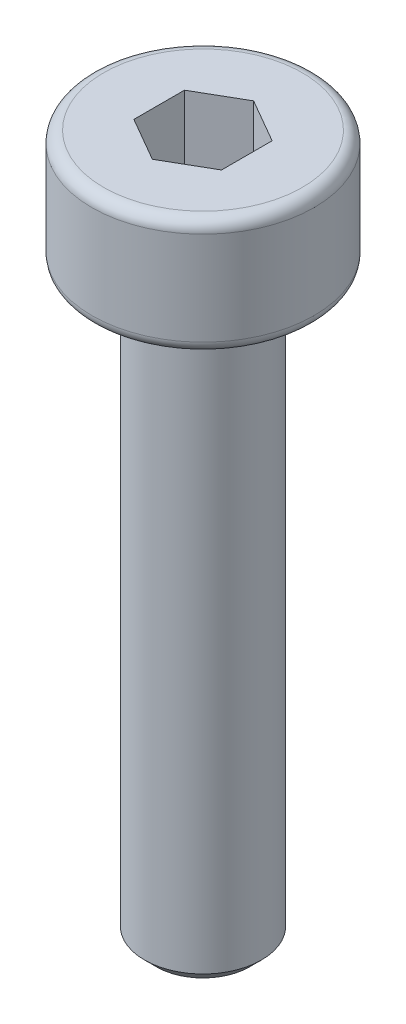
ISO-10303-21;
HEADER;
FILE_DESCRIPTION(('STEP AP214'),'2;1');
FILE_NAME('part.step','',(''),(''),'','','');
FILE_SCHEMA(('AUTOMOTIVE_DESIGN { 1 0 10303 214 1 1 1 1 }'));
ENDSEC;
DATA;
#1=APPLICATION_CONTEXT('core data for automotive mechanical design processes');
#2=APPLICATION_PROTOCOL_DEFINITION('international standard','automotive_design',2000,#1);
#3=PRODUCT_CONTEXT('',#1,'mechanical');
#4=PRODUCT('Part','Part','',(#3));
#5=PRODUCT_RELATED_PRODUCT_CATEGORY('part','',(#4));
#6=PRODUCT_DEFINITION_FORMATION('','',#4);
#7=PRODUCT_DEFINITION_CONTEXT('part definition',#1,'design');
#8=PRODUCT_DEFINITION('design','',#6,#7);
#9=PRODUCT_DEFINITION_SHAPE('','',#8);
#10=(LENGTH_UNIT() NAMED_UNIT(*) SI_UNIT(.MILLI.,.METRE.));
#11=(NAMED_UNIT(*) PLANE_ANGLE_UNIT() SI_UNIT($,.RADIAN.));
#12=(NAMED_UNIT(*) SI_UNIT($,.STERADIAN.) SOLID_ANGLE_UNIT());
#13=UNCERTAINTY_MEASURE_WITH_UNIT(LENGTH_MEASURE(1.E-05),#10,'distance_accuracy_value','');
#14=(GEOMETRIC_REPRESENTATION_CONTEXT(3) GLOBAL_UNCERTAINTY_ASSIGNED_CONTEXT((#13)) GLOBAL_UNIT_ASSIGNED_CONTEXT((#10,
#11,#12)) REPRESENTATION_CONTEXT('',''));
#15=CARTESIAN_POINT('',(0.,0.,0.));
#16=DIRECTION('',(0.,0.,1.));
#17=DIRECTION('',(1.,0.,0.));
#18=AXIS2_PLACEMENT_3D('',#15,#16,#17);
#19=CARTESIAN_POINT('',(0.,2.,0.));
#20=DIRECTION('',(0.,1.,0.));
#21=DIRECTION('',(0.,0.,1.));
#22=AXIS2_PLACEMENT_3D('',#19,#20,#21);
#23=PLANE('',#22);
#24=CARTESIAN_POINT('',(0.,2.,0.));
#25=DIRECTION('',(0.,1.,0.));
#26=DIRECTION('',(0.,0.,1.));
#27=AXIS2_PLACEMENT_3D('',#24,#25,#26);
#28=CIRCLE('',#27,1.7);
#29=CARTESIAN_POINT('',(0.,2.,1.7));
#30=VERTEX_POINT('',#29);
#31=EDGE_CURVE('E127',#30,#30,#28,.T.);
#32=ORIENTED_EDGE('',*,*,#31,.T.);
#33=EDGE_LOOP('',(#32));
#34=FACE_BOUND('',#33,.T.);
#35=DIRECTION('',(-0.866025403784439,0.,0.5));
#36=VECTOR('',#35,1.);
#37=CARTESIAN_POINT('',(0.,2.,-0.866025403784439));
#38=LINE('',#37,#36);
#39=CARTESIAN_POINT('',(0.,2.,-0.866025403784439));
#40=VERTEX_POINT('',#39);
#41=CARTESIAN_POINT('',(-0.75,2.,-0.43301270189222));
#42=VERTEX_POINT('',#41);
#43=EDGE_CURVE('E32',#40,#42,#38,.T.);
#44=ORIENTED_EDGE('',*,*,#43,.F.);
#45=DIRECTION('',(-0.866025403784439,0.,-0.5));
#46=VECTOR('',#45,1.);
#47=CARTESIAN_POINT('',(0.75,2.,-0.43301270189222));
#48=LINE('',#47,#46);
#49=CARTESIAN_POINT('',(0.75,2.,-0.43301270189222));
#50=VERTEX_POINT('',#49);
#51=EDGE_CURVE('E115',#50,#40,#48,.T.);
#52=ORIENTED_EDGE('',*,*,#51,.F.);
#53=DIRECTION('',(0.,0.,-1.));
#54=VECTOR('',#53,1.);
#55=CARTESIAN_POINT('',(0.75,2.,0.433012701892219));
#56=LINE('',#55,#54);
#57=CARTESIAN_POINT('',(0.75,2.,0.433012701892219));
#58=VERTEX_POINT('',#57);
#59=EDGE_CURVE('E113',#58,#50,#56,.T.);
#60=ORIENTED_EDGE('',*,*,#59,.F.);
#61=DIRECTION('',(0.866025403784439,0.,-0.5));
#62=VECTOR('',#61,1.);
#63=CARTESIAN_POINT('',(0.,2.,0.866025403784439));
#64=LINE('',#63,#62);
#65=CARTESIAN_POINT('',(0.,2.,0.866025403784439));
#66=VERTEX_POINT('',#65);
#67=EDGE_CURVE('E80',#66,#58,#64,.T.);
#68=ORIENTED_EDGE('',*,*,#67,.F.);
#69=DIRECTION('',(0.866025403784439,0.,0.5));
#70=VECTOR('',#69,1.);
#71=CARTESIAN_POINT('',(-0.75,2.,0.43301270189222));
#72=LINE('',#71,#70);
#73=CARTESIAN_POINT('',(-0.75,2.,0.43301270189222));
#74=VERTEX_POINT('',#73);
#75=EDGE_CURVE('E109',#74,#66,#72,.T.);
#76=ORIENTED_EDGE('',*,*,#75,.F.);
#77=DIRECTION('',(0.,0.,1.));
#78=VECTOR('',#77,1.);
#79=CARTESIAN_POINT('',(-0.75,2.,-0.43301270189222));
#80=LINE('',#79,#78);
#81=EDGE_CURVE('E106',#42,#74,#80,.T.);
#82=ORIENTED_EDGE('',*,*,#81,.F.);
#83=EDGE_LOOP('',(#44,#52,#60,#68,#76,#82));
#84=FACE_BOUND('',#83,.T.);
#85=ADVANCED_FACE('F17',(#34,#84),#23,.T.);
#86=CARTESIAN_POINT('',(0.,60.1595545799248,0.));
#87=DIRECTION('',(0.,1.,0.));
#88=DIRECTION('',(0.,0.,1.));
#89=AXIS2_PLACEMENT_3D('',#86,#87,#88);
#90=CYLINDRICAL_SURFACE('',#89,1.9);
#91=CARTESIAN_POINT('',(0.,1.8,0.));
#92=DIRECTION('',(0.,1.,0.));
#93=DIRECTION('',(0.,0.,1.));
#94=AXIS2_PLACEMENT_3D('',#91,#92,#93);
#95=CIRCLE('',#94,1.9);
#96=CARTESIAN_POINT('',(0.,1.8,1.9));
#97=VERTEX_POINT('',#96);
#98=EDGE_CURVE('E133',#97,#97,#95,.F.);
#99=ORIENTED_EDGE('',*,*,#98,.T.);
#100=EDGE_LOOP('',(#99));
#101=FACE_BOUND('',#100,.T.);
#102=CARTESIAN_POINT('',(0.,0.2,0.));
#103=DIRECTION('',(0.,-1.,0.));
#104=DIRECTION('',(0.,0.,-1.));
#105=AXIS2_PLACEMENT_3D('',#102,#103,#104);
#106=CIRCLE('',#105,1.9);
#107=CARTESIAN_POINT('',(0.,0.2,-1.9));
#108=VERTEX_POINT('',#107);
#109=EDGE_CURVE('E130',#108,#108,#106,.F.);
#110=ORIENTED_EDGE('',*,*,#109,.T.);
#111=EDGE_LOOP('',(#110));
#112=FACE_BOUND('',#111,.T.);
#113=ADVANCED_FACE('F156',(#101,#112),#90,.T.);
#114=CARTESIAN_POINT('',(-1.,0.,0.));
#115=DIRECTION('',(0.,-1.,0.));
#116=DIRECTION('',(0.,0.,-1.));
#117=AXIS2_PLACEMENT_3D('',#114,#115,#116);
#118=PLANE('',#117);
#119=CARTESIAN_POINT('',(0.,0.,0.));
#120=DIRECTION('',(0.,-1.,0.));
#121=DIRECTION('',(0.,0.,-1.));
#122=AXIS2_PLACEMENT_3D('',#119,#120,#121);
#123=CIRCLE('',#122,1.7);
#124=CARTESIAN_POINT('',(0.,0.,-1.7));
#125=VERTEX_POINT('',#124);
#126=EDGE_CURVE('E136',#125,#125,#123,.T.);
#127=ORIENTED_EDGE('',*,*,#126,.T.);
#128=EDGE_LOOP('',(#127));
#129=FACE_BOUND('',#128,.T.);
#130=CARTESIAN_POINT('',(0.,0.,0.));
#131=DIRECTION('',(0.,1.,0.));
#132=DIRECTION('',(0.,0.,1.));
#133=AXIS2_PLACEMENT_3D('',#130,#131,#132);
#134=CIRCLE('',#133,1.);
#135=CARTESIAN_POINT('',(0.,0.,1.));
#136=VERTEX_POINT('',#135);
#137=EDGE_CURVE('E119',#136,#136,#134,.T.);
#138=ORIENTED_EDGE('',*,*,#137,.T.);
#139=EDGE_LOOP('',(#138));
#140=FACE_BOUND('',#139,.T.);
#141=ADVANCED_FACE('F163',(#129,#140),#118,.T.);
#142=CARTESIAN_POINT('',(0.,60.1595545799248,0.));
#143=DIRECTION('',(0.,1.,0.));
#144=DIRECTION('',(0.,0.,1.));
#145=AXIS2_PLACEMENT_3D('',#142,#143,#144);
#146=CYLINDRICAL_SURFACE('',#145,1.);
#147=CARTESIAN_POINT('',(0.,-9.8,0.));
#148=DIRECTION('',(0.,-1.,0.));
#149=DIRECTION('',(0.,0.,-1.));
#150=AXIS2_PLACEMENT_3D('',#147,#148,#149);
#151=CIRCLE('',#150,1.);
#152=CARTESIAN_POINT('',(0.,-9.8,-1.));
#153=VERTEX_POINT('',#152);
#154=EDGE_CURVE('E25',#153,#153,#151,.F.);
#155=ORIENTED_EDGE('',*,*,#154,.T.);
#156=EDGE_LOOP('',(#155));
#157=FACE_BOUND('',#156,.T.);
#158=ORIENTED_EDGE('',*,*,#137,.F.);
#159=EDGE_LOOP('',(#158));
#160=FACE_BOUND('',#159,.T.);
#161=ADVANCED_FACE('F141',(#157,#160),#146,.T.);
#162=CARTESIAN_POINT('',(0.,-10.,0.));
#163=DIRECTION('',(0.,-1.,0.));
#164=DIRECTION('',(0.,0.,-1.));
#165=AXIS2_PLACEMENT_3D('',#162,#163,#164);
#166=PLANE('',#165);
#167=CARTESIAN_POINT('',(0.,-10.,0.));
#168=DIRECTION('',(0.,-1.,0.));
#169=DIRECTION('',(0.,0.,-1.));
#170=AXIS2_PLACEMENT_3D('',#167,#168,#169);
#171=CIRCLE('',#170,0.799999999999985);
#172=CARTESIAN_POINT('',(0.,-10.,-0.799999999999985));
#173=VERTEX_POINT('',#172);
#174=EDGE_CURVE('E11',#173,#173,#171,.T.);
#175=ORIENTED_EDGE('',*,*,#174,.T.);
#176=EDGE_LOOP('',(#175));
#177=FACE_BOUND('',#176,.T.);
#178=ADVANCED_FACE('F204',(#177),#166,.T.);
#179=CARTESIAN_POINT('',(0.,0.7,-0.866025403784439));
#180=DIRECTION('',(-0.5,0.,-0.866025403784439));
#181=DIRECTION('',(-0.866025403784439,0.,0.5));
#182=AXIS2_PLACEMENT_3D('',#179,#180,#181);
#183=PLANE('',#182);
#184=ORIENTED_EDGE('',*,*,#43,.T.);
#185=DIRECTION('',(0.,1.,0.));
#186=VECTOR('',#185,1.);
#187=CARTESIAN_POINT('',(-0.75,0.7,-0.43301270189222));
#188=LINE('',#187,#186);
#189=CARTESIAN_POINT('',(-0.75,0.7,-0.43301270189222));
#190=VERTEX_POINT('',#189);
#191=EDGE_CURVE('E62',#190,#42,#188,.T.);
#192=ORIENTED_EDGE('',*,*,#191,.F.);
#193=DIRECTION('',(-0.866025403784439,0.,0.5));
#194=VECTOR('',#193,1.);
#195=CARTESIAN_POINT('',(0.,0.7,-0.866025403784439));
#196=LINE('',#195,#194);
#197=CARTESIAN_POINT('',(0.,0.7,-0.866025403784439));
#198=VERTEX_POINT('',#197);
#199=EDGE_CURVE('E117',#198,#190,#196,.T.);
#200=ORIENTED_EDGE('',*,*,#199,.F.);
#201=DIRECTION('',(0.,1.,0.));
#202=VECTOR('',#201,1.);
#203=CARTESIAN_POINT('',(0.,0.7,-0.866025403784439));
#204=LINE('',#203,#202);
#205=EDGE_CURVE('E40',#198,#40,#204,.T.);
#206=ORIENTED_EDGE('',*,*,#205,.T.);
#207=EDGE_LOOP('',(#184,#192,#200,#206));
#208=FACE_BOUND('',#207,.T.);
#209=ADVANCED_FACE('F194',(#208),#183,.F.);
#210=CARTESIAN_POINT('',(0.75,0.7,-0.43301270189222));
#211=DIRECTION('',(0.5,0.,-0.866025403784439));
#212=DIRECTION('',(-0.866025403784439,0.,-0.5));
#213=AXIS2_PLACEMENT_3D('',#210,#211,#212);
#214=PLANE('',#213);
#215=ORIENTED_EDGE('',*,*,#51,.T.);
#216=ORIENTED_EDGE('',*,*,#205,.F.);
#217=DIRECTION('',(-0.866025403784439,0.,-0.5));
#218=VECTOR('',#217,1.);
#219=CARTESIAN_POINT('',(0.75,0.7,-0.43301270189222));
#220=LINE('',#219,#218);
#221=CARTESIAN_POINT('',(0.75,0.7,-0.43301270189222));
#222=VERTEX_POINT('',#221);
#223=EDGE_CURVE('E92',#222,#198,#220,.T.);
#224=ORIENTED_EDGE('',*,*,#223,.F.);
#225=DIRECTION('',(0.,1.,0.));
#226=VECTOR('',#225,1.);
#227=CARTESIAN_POINT('',(0.75,0.7,-0.43301270189222));
#228=LINE('',#227,#226);
#229=EDGE_CURVE('E84',#222,#50,#228,.T.);
#230=ORIENTED_EDGE('',*,*,#229,.T.);
#231=EDGE_LOOP('',(#215,#216,#224,#230));
#232=FACE_BOUND('',#231,.T.);
#233=ADVANCED_FACE('F191',(#232),#214,.F.);
#234=CARTESIAN_POINT('',(0.75,0.7,0.433012701892219));
#235=DIRECTION('',(1.,0.,0.));
#236=DIRECTION('',(0.,0.,-1.));
#237=AXIS2_PLACEMENT_3D('',#234,#235,#236);
#238=PLANE('',#237);
#239=ORIENTED_EDGE('',*,*,#59,.T.);
#240=ORIENTED_EDGE('',*,*,#229,.F.);
#241=DIRECTION('',(0.,0.,-1.));
#242=VECTOR('',#241,1.);
#243=CARTESIAN_POINT('',(0.75,0.7,0.433012701892219));
#244=LINE('',#243,#242);
#245=CARTESIAN_POINT('',(0.75,0.7,0.433012701892219));
#246=VERTEX_POINT('',#245);
#247=EDGE_CURVE('E88',#246,#222,#244,.T.);
#248=ORIENTED_EDGE('',*,*,#247,.F.);
#249=DIRECTION('',(0.,1.,0.));
#250=VECTOR('',#249,1.);
#251=CARTESIAN_POINT('',(0.75,0.7,0.433012701892219));
#252=LINE('',#251,#250);
#253=EDGE_CURVE('E73',#246,#58,#252,.T.);
#254=ORIENTED_EDGE('',*,*,#253,.T.);
#255=EDGE_LOOP('',(#239,#240,#248,#254));
#256=FACE_BOUND('',#255,.T.);
#257=ADVANCED_FACE('F89',(#256),#238,.F.);
#258=CARTESIAN_POINT('',(0.,0.7,0.866025403784439));
#259=DIRECTION('',(0.5,0.,0.866025403784439));
#260=DIRECTION('',(0.866025403784439,0.,-0.5));
#261=AXIS2_PLACEMENT_3D('',#258,#259,#260);
#262=PLANE('',#261);
#263=ORIENTED_EDGE('',*,*,#67,.T.);
#264=ORIENTED_EDGE('',*,*,#253,.F.);
#265=DIRECTION('',(0.866025403784439,0.,-0.5));
#266=VECTOR('',#265,1.);
#267=CARTESIAN_POINT('',(0.,0.7,0.866025403784439));
#268=LINE('',#267,#266);
#269=CARTESIAN_POINT('',(0.,0.7,0.866025403784439));
#270=VERTEX_POINT('',#269);
#271=EDGE_CURVE('E77',#270,#246,#268,.T.);
#272=ORIENTED_EDGE('',*,*,#271,.F.);
#273=DIRECTION('',(0.,1.,0.));
#274=VECTOR('',#273,1.);
#275=CARTESIAN_POINT('',(0.,0.7,0.866025403784439));
#276=LINE('',#275,#274);
#277=EDGE_CURVE('E85',#270,#66,#276,.T.);
#278=ORIENTED_EDGE('',*,*,#277,.T.);
#279=EDGE_LOOP('',(#263,#264,#272,#278));
#280=FACE_BOUND('',#279,.T.);
#281=ADVANCED_FACE('F75',(#280),#262,.F.);
#282=CARTESIAN_POINT('',(-0.75,0.7,0.43301270189222));
#283=DIRECTION('',(-0.5,0.,0.866025403784439));
#284=DIRECTION('',(0.866025403784439,0.,0.5));
#285=AXIS2_PLACEMENT_3D('',#282,#283,#284);
#286=PLANE('',#285);
#287=ORIENTED_EDGE('',*,*,#75,.T.);
#288=ORIENTED_EDGE('',*,*,#277,.F.);
#289=DIRECTION('',(0.866025403784439,0.,0.5));
#290=VECTOR('',#289,1.);
#291=CARTESIAN_POINT('',(-0.75,0.7,0.43301270189222));
#292=LINE('',#291,#290);
#293=CARTESIAN_POINT('',(-0.75,0.7,0.43301270189222));
#294=VERTEX_POINT('',#293);
#295=EDGE_CURVE('E98',#294,#270,#292,.T.);
#296=ORIENTED_EDGE('',*,*,#295,.F.);
#297=DIRECTION('',(0.,1.,0.));
#298=VECTOR('',#297,1.);
#299=CARTESIAN_POINT('',(-0.75,0.7,0.43301270189222));
#300=LINE('',#299,#298);
#301=EDGE_CURVE('E122',#294,#74,#300,.T.);
#302=ORIENTED_EDGE('',*,*,#301,.T.);
#303=EDGE_LOOP('',(#287,#288,#296,#302));
#304=FACE_BOUND('',#303,.T.);
#305=ADVANCED_FACE('F187',(#304),#286,.F.);
#306=CARTESIAN_POINT('',(-0.75,0.7,-0.43301270189222));
#307=DIRECTION('',(-1.,0.,0.));
#308=DIRECTION('',(0.,0.,1.));
#309=AXIS2_PLACEMENT_3D('',#306,#307,#308);
#310=PLANE('',#309);
#311=ORIENTED_EDGE('',*,*,#81,.T.);
#312=ORIENTED_EDGE('',*,*,#301,.F.);
#313=DIRECTION('',(0.,0.,1.));
#314=VECTOR('',#313,1.);
#315=CARTESIAN_POINT('',(-0.75,0.7,-0.43301270189222));
#316=LINE('',#315,#314);
#317=EDGE_CURVE('E100',#190,#294,#316,.T.);
#318=ORIENTED_EDGE('',*,*,#317,.F.);
#319=ORIENTED_EDGE('',*,*,#191,.T.);
#320=EDGE_LOOP('',(#311,#312,#318,#319));
#321=FACE_BOUND('',#320,.T.);
#322=ADVANCED_FACE('F175',(#321),#310,.F.);
#323=CARTESIAN_POINT('',(0.,0.7,0.));
#324=DIRECTION('',(0.,1.,0.));
#325=DIRECTION('',(0.,0.,1.));
#326=AXIS2_PLACEMENT_3D('',#323,#324,#325);
#327=PLANE('',#326);
#328=ORIENTED_EDGE('',*,*,#199,.T.);
#329=ORIENTED_EDGE('',*,*,#317,.T.);
#330=ORIENTED_EDGE('',*,*,#295,.T.);
#331=ORIENTED_EDGE('',*,*,#271,.T.);
#332=ORIENTED_EDGE('',*,*,#247,.T.);
#333=ORIENTED_EDGE('',*,*,#223,.T.);
#334=EDGE_LOOP('',(#328,#329,#330,#331,#332,#333));
#335=FACE_BOUND('',#334,.T.);
#336=ADVANCED_FACE('F95',(#335),#327,.T.);
#337=CARTESIAN_POINT('',(0.,1.8,0.));
#338=DIRECTION('',(0.,1.,0.));
#339=DIRECTION('',(0.,0.,1.));
#340=AXIS2_PLACEMENT_3D('',#337,#338,#339);
#341=TOROIDAL_SURFACE('',#340,1.7,0.2);
#342=ORIENTED_EDGE('',*,*,#98,.F.);
#343=EDGE_LOOP('',(#342));
#344=FACE_BOUND('',#343,.T.);
#345=ORIENTED_EDGE('',*,*,#31,.F.);
#346=EDGE_LOOP('',(#345));
#347=FACE_BOUND('',#346,.T.);
#348=ADVANCED_FACE('F152',(#344,#347),#341,.T.);
#349=CARTESIAN_POINT('',(0.,0.2,0.));
#350=DIRECTION('',(0.,-1.,0.));
#351=DIRECTION('',(0.,0.,-1.));
#352=AXIS2_PLACEMENT_3D('',#349,#350,#351);
#353=TOROIDAL_SURFACE('',#352,1.7,0.2);
#354=ORIENTED_EDGE('',*,*,#126,.F.);
#355=EDGE_LOOP('',(#354));
#356=FACE_BOUND('',#355,.T.);
#357=ORIENTED_EDGE('',*,*,#109,.F.);
#358=EDGE_LOOP('',(#357));
#359=FACE_BOUND('',#358,.T.);
#360=ADVANCED_FACE('F145',(#356,#359),#353,.T.);
#361=CARTESIAN_POINT('',(0.,-9.8,0.));
#362=DIRECTION('',(0.,1.,0.));
#363=DIRECTION('',(0.,0.,1.));
#364=AXIS2_PLACEMENT_3D('',#361,#362,#363);
#365=CONICAL_SURFACE('',#364,1.,0.785398163397473);
#366=ORIENTED_EDGE('',*,*,#174,.F.);
#367=EDGE_LOOP('',(#366));
#368=FACE_BOUND('',#367,.T.);
#369=ORIENTED_EDGE('',*,*,#154,.F.);
#370=EDGE_LOOP('',(#369));
#371=FACE_BOUND('',#370,.T.);
#372=ADVANCED_FACE('F19',(#368,#371),#365,.T.);
#373=CLOSED_SHELL('',(#85,#113,#141,#161,#178,#209,#233,#257,#281,#305,#322,#336,#348,#360,#372));
#374=MANIFOLD_SOLID_BREP('B1',#373);
#375=ADVANCED_BREP_SHAPE_REPRESENTATION('',(#18,#374),#14);
#376=SHAPE_DEFINITION_REPRESENTATION(#9,#375);
ENDSEC;
END-ISO-10303-21;
